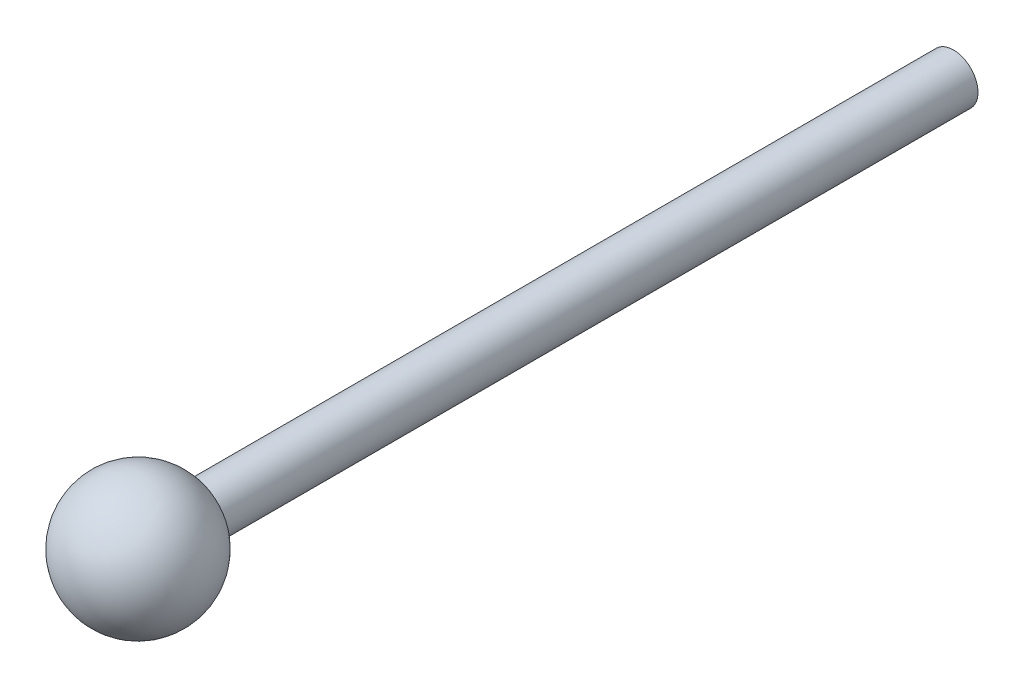
ISO-10303-21;
HEADER;
FILE_DESCRIPTION(('STEP AP214'),'2;1');
FILE_NAME('part.step','',(''),(''),'','','');
FILE_SCHEMA(('AUTOMOTIVE_DESIGN { 1 0 10303 214 1 1 1 1 }'));
ENDSEC;
DATA;
#1=APPLICATION_CONTEXT('core data for automotive mechanical design processes');
#2=APPLICATION_PROTOCOL_DEFINITION('international standard','automotive_design',2000,#1);
#3=PRODUCT_CONTEXT('',#1,'mechanical');
#4=PRODUCT('Part','Part','',(#3));
#5=PRODUCT_RELATED_PRODUCT_CATEGORY('part','',(#4));
#6=PRODUCT_DEFINITION_FORMATION('','',#4);
#7=PRODUCT_DEFINITION_CONTEXT('part definition',#1,'design');
#8=PRODUCT_DEFINITION('design','',#6,#7);
#9=PRODUCT_DEFINITION_SHAPE('','',#8);
#10=(LENGTH_UNIT() NAMED_UNIT(*) SI_UNIT(.MILLI.,.METRE.));
#11=(NAMED_UNIT(*) PLANE_ANGLE_UNIT() SI_UNIT($,.RADIAN.));
#12=(NAMED_UNIT(*) SI_UNIT($,.STERADIAN.) SOLID_ANGLE_UNIT());
#13=UNCERTAINTY_MEASURE_WITH_UNIT(LENGTH_MEASURE(1.E-05),#10,'distance_accuracy_value','');
#14=(GEOMETRIC_REPRESENTATION_CONTEXT(3) GLOBAL_UNCERTAINTY_ASSIGNED_CONTEXT((#13)) GLOBAL_UNIT_ASSIGNED_CONTEXT((#10,
#11,#12)) REPRESENTATION_CONTEXT('',''));
#15=CARTESIAN_POINT('',(0.,0.,0.));
#16=DIRECTION('',(0.,0.,1.));
#17=DIRECTION('',(1.,0.,0.));
#18=AXIS2_PLACEMENT_3D('',#15,#16,#17);
#19=CARTESIAN_POINT('',(0.,0.,0.));
#20=DIRECTION('',(0.,1.,0.));
#21=DIRECTION('',(1.,0.,0.));
#22=AXIS2_PLACEMENT_3D('',#19,#20,#21);
#23=SPHERICAL_SURFACE('',#22,20.);
#24=CARTESIAN_POINT('',(0.,0.,0.));
#25=DIRECTION('',(0.,0.,1.));
#26=DIRECTION('',(1.,0.,0.));
#27=AXIS2_PLACEMENT_3D('',#24,#25,#26);
#28=SPHERICAL_SURFACE('',#27,20.);
#29=CARTESIAN_POINT('',(0.,0.,-18.5404962177392));
#30=DIRECTION('',(0.,0.,1.));
#31=DIRECTION('',(1.,0.,0.));
#32=AXIS2_PLACEMENT_3D('',#29,#30,#31);
#33=CIRCLE('',#32,7.5);
#34=CARTESIAN_POINT('',(7.5,0.,-18.5404962177392));
#35=VERTEX_POINT('',#34);
#36=EDGE_CURVE('E35',#35,#35,#33,.F.);
#37=ORIENTED_EDGE('',*,*,#36,.F.);
#38=EDGE_LOOP('',(#37));
#39=FACE_BOUND('',#38,.T.);
#40=ADVANCED_FACE('F31',(#39),#28,.T.);
#41=CARTESIAN_POINT('',(0.,0.,-250.));
#42=DIRECTION('',(0.,0.,1.));
#43=DIRECTION('',(1.,0.,0.));
#44=AXIS2_PLACEMENT_3D('',#41,#42,#43);
#45=CYLINDRICAL_SURFACE('',#44,7.5);
#46=CARTESIAN_POINT('',(0.,0.,-250.));
#47=DIRECTION('',(0.,0.,1.));
#48=DIRECTION('',(1.,0.,0.));
#49=AXIS2_PLACEMENT_3D('',#46,#47,#48);
#50=CIRCLE('',#49,7.5);
#51=CARTESIAN_POINT('',(7.5,0.,-250.));
#52=VERTEX_POINT('',#51);
#53=EDGE_CURVE('E10',#52,#52,#50,.T.);
#54=ORIENTED_EDGE('',*,*,#53,.T.);
#55=EDGE_LOOP('',(#54));
#56=FACE_BOUND('',#55,.T.);
#57=ORIENTED_EDGE('',*,*,#36,.T.);
#58=EDGE_LOOP('',(#57));
#59=FACE_BOUND('',#58,.T.);
#60=ADVANCED_FACE('F33',(#56,#59),#45,.T.);
#61=CARTESIAN_POINT('',(0.,0.,-250.));
#62=DIRECTION('',(0.,0.,1.));
#63=DIRECTION('',(1.,0.,0.));
#64=AXIS2_PLACEMENT_3D('',#61,#62,#63);
#65=PLANE('',#64);
#66=ORIENTED_EDGE('',*,*,#53,.F.);
#67=EDGE_LOOP('',(#66));
#68=FACE_BOUND('',#67,.T.);
#69=ADVANCED_FACE('F50',(#68),#65,.F.);
#70=CLOSED_SHELL('',(#40,#60,#69));
#71=MANIFOLD_SOLID_BREP('B2',#70);
#72=ADVANCED_BREP_SHAPE_REPRESENTATION('',(#18,#71),#14);
#73=SHAPE_DEFINITION_REPRESENTATION(#9,#72);
ENDSEC;
END-ISO-10303-21;
